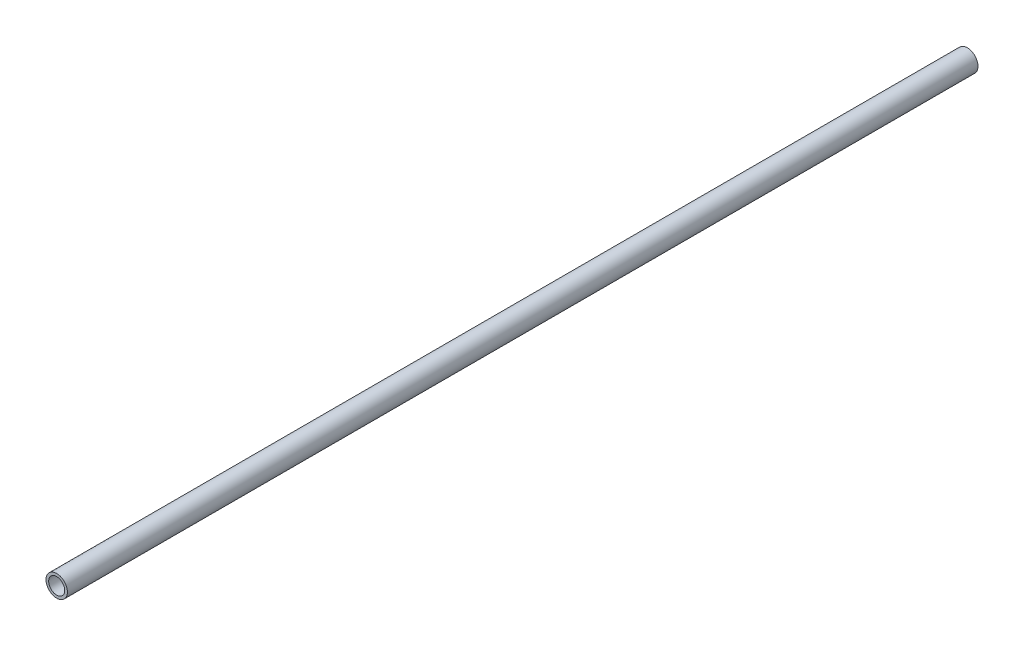
ISO-10303-21;
HEADER;
FILE_DESCRIPTION(('STEP AP214'),'2;1');
FILE_NAME('part.step','',(''),(''),'','','');
FILE_SCHEMA(('AUTOMOTIVE_DESIGN { 1 0 10303 214 1 1 1 1 }'));
ENDSEC;
DATA;
#1=APPLICATION_CONTEXT('core data for automotive mechanical design processes');
#2=APPLICATION_PROTOCOL_DEFINITION('international standard','automotive_design',2000,#1);
#3=PRODUCT_CONTEXT('',#1,'mechanical');
#4=PRODUCT('Part','Part','',(#3));
#5=PRODUCT_RELATED_PRODUCT_CATEGORY('part','',(#4));
#6=PRODUCT_DEFINITION_FORMATION('','',#4);
#7=PRODUCT_DEFINITION_CONTEXT('part definition',#1,'design');
#8=PRODUCT_DEFINITION('design','',#6,#7);
#9=PRODUCT_DEFINITION_SHAPE('','',#8);
#10=(LENGTH_UNIT() NAMED_UNIT(*) SI_UNIT(.MILLI.,.METRE.));
#11=(NAMED_UNIT(*) PLANE_ANGLE_UNIT() SI_UNIT($,.RADIAN.));
#12=(NAMED_UNIT(*) SI_UNIT($,.STERADIAN.) SOLID_ANGLE_UNIT());
#13=UNCERTAINTY_MEASURE_WITH_UNIT(LENGTH_MEASURE(1.E-05),#10,'distance_accuracy_value','');
#14=(GEOMETRIC_REPRESENTATION_CONTEXT(3) GLOBAL_UNCERTAINTY_ASSIGNED_CONTEXT((#13)) GLOBAL_UNIT_ASSIGNED_CONTEXT((#10,
#11,#12)) REPRESENTATION_CONTEXT('',''));
#15=CARTESIAN_POINT('',(0.,0.,0.));
#16=DIRECTION('',(0.,0.,1.));
#17=DIRECTION('',(1.,0.,0.));
#18=AXIS2_PLACEMENT_3D('',#15,#16,#17);
#19=CARTESIAN_POINT('',(0.,0.,340.));
#20=DIRECTION('',(0.,0.,1.));
#21=DIRECTION('',(1.,0.,0.));
#22=AXIS2_PLACEMENT_3D('',#19,#20,#21);
#23=PLANE('',#22);
#24=CARTESIAN_POINT('',(0.,0.,340.));
#25=DIRECTION('',(0.,0.,1.));
#26=DIRECTION('',(1.,0.,0.));
#27=AXIS2_PLACEMENT_3D('',#24,#25,#26);
#28=CIRCLE('',#27,4.);
#29=CARTESIAN_POINT('',(4.,0.,340.));
#30=VERTEX_POINT('',#29);
#31=EDGE_CURVE('E10',#30,#30,#28,.T.);
#32=ORIENTED_EDGE('',*,*,#31,.T.);
#33=EDGE_LOOP('',(#32));
#34=FACE_BOUND('',#33,.T.);
#35=CARTESIAN_POINT('',(0.,0.,340.));
#36=DIRECTION('',(0.,0.,1.));
#37=DIRECTION('',(1.,0.,0.));
#38=AXIS2_PLACEMENT_3D('',#35,#36,#37);
#39=CIRCLE('',#38,3.);
#40=CARTESIAN_POINT('',(3.,0.,340.));
#41=VERTEX_POINT('',#40);
#42=EDGE_CURVE('E48',#41,#41,#39,.T.);
#43=ORIENTED_EDGE('',*,*,#42,.F.);
#44=EDGE_LOOP('',(#43));
#45=FACE_BOUND('',#44,.T.);
#46=ADVANCED_FACE('F37',(#34,#45),#23,.T.);
#47=CARTESIAN_POINT('',(0.,0.,0.));
#48=DIRECTION('',(0.,0.,1.));
#49=DIRECTION('',(1.,0.,0.));
#50=AXIS2_PLACEMENT_3D('',#47,#48,#49);
#51=PLANE('',#50);
#52=CARTESIAN_POINT('',(0.,0.,0.));
#53=DIRECTION('',(0.,0.,1.));
#54=DIRECTION('',(1.,0.,0.));
#55=AXIS2_PLACEMENT_3D('',#52,#53,#54);
#56=CIRCLE('',#55,4.);
#57=CARTESIAN_POINT('',(4.,0.,0.));
#58=VERTEX_POINT('',#57);
#59=EDGE_CURVE('E41',#58,#58,#56,.T.);
#60=ORIENTED_EDGE('',*,*,#59,.F.);
#61=EDGE_LOOP('',(#60));
#62=FACE_BOUND('',#61,.T.);
#63=CARTESIAN_POINT('',(0.,0.,0.));
#64=DIRECTION('',(0.,0.,1.));
#65=DIRECTION('',(1.,0.,0.));
#66=AXIS2_PLACEMENT_3D('',#63,#64,#65);
#67=CIRCLE('',#66,3.);
#68=CARTESIAN_POINT('',(3.,0.,0.));
#69=VERTEX_POINT('',#68);
#70=EDGE_CURVE('E50',#69,#69,#67,.T.);
#71=ORIENTED_EDGE('',*,*,#70,.T.);
#72=EDGE_LOOP('',(#71));
#73=FACE_BOUND('',#72,.T.);
#74=ADVANCED_FACE('F60',(#62,#73),#51,.F.);
#75=CARTESIAN_POINT('',(0.,0.,340.));
#76=DIRECTION('',(0.,0.,-1.));
#77=DIRECTION('',(-1.,0.,0.));
#78=AXIS2_PLACEMENT_3D('',#75,#76,#77);
#79=CYLINDRICAL_SURFACE('',#78,4.);
#80=ORIENTED_EDGE('',*,*,#31,.F.);
#81=EDGE_LOOP('',(#80));
#82=FACE_BOUND('',#81,.T.);
#83=ORIENTED_EDGE('',*,*,#59,.T.);
#84=EDGE_LOOP('',(#83));
#85=FACE_BOUND('',#84,.T.);
#86=ADVANCED_FACE('F39',(#82,#85),#79,.T.);
#87=CARTESIAN_POINT('',(0.,0.,340.));
#88=DIRECTION('',(0.,0.,-1.));
#89=DIRECTION('',(-1.,0.,0.));
#90=AXIS2_PLACEMENT_3D('',#87,#88,#89);
#91=CYLINDRICAL_SURFACE('',#90,3.);
#92=ORIENTED_EDGE('',*,*,#42,.T.);
#93=EDGE_LOOP('',(#92));
#94=FACE_BOUND('',#93,.T.);
#95=ORIENTED_EDGE('',*,*,#70,.F.);
#96=EDGE_LOOP('',(#95));
#97=FACE_BOUND('',#96,.T.);
#98=ADVANCED_FACE('F56',(#94,#97),#91,.F.);
#99=CLOSED_SHELL('',(#46,#74,#86,#98));
#100=MANIFOLD_SOLID_BREP('B2',#99);
#101=ADVANCED_BREP_SHAPE_REPRESENTATION('',(#18,#100),#14);
#102=SHAPE_DEFINITION_REPRESENTATION(#9,#101);
ENDSEC;
END-ISO-10303-21;
